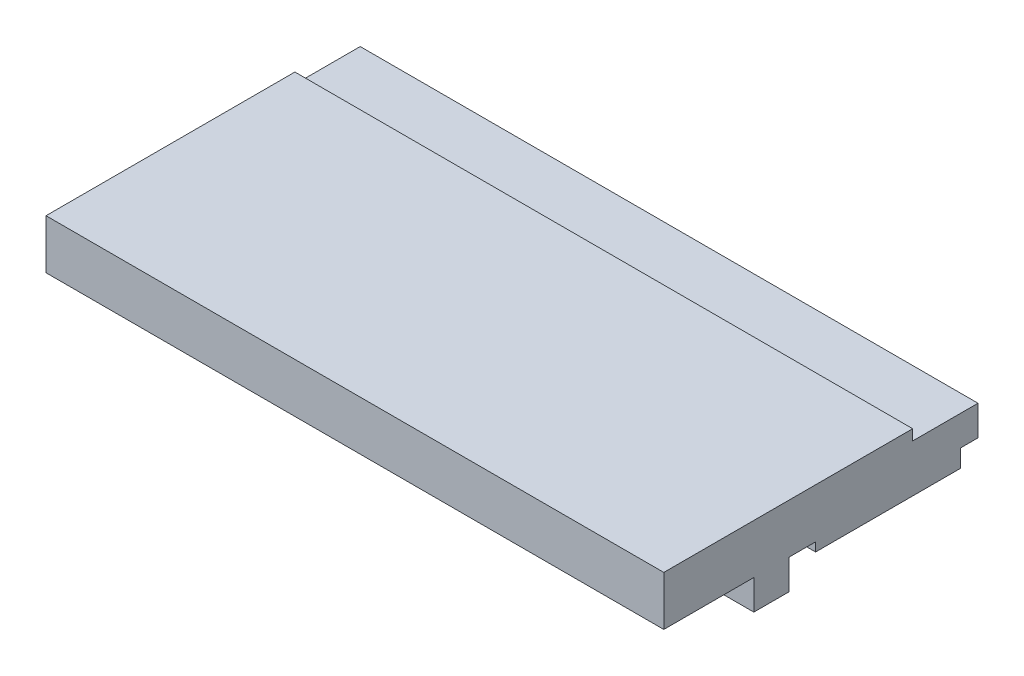
ISO-10303-21;
HEADER;
FILE_DESCRIPTION(('STEP AP214'),'2;1');
FILE_NAME('part.step','',(''),(''),'','','');
FILE_SCHEMA(('AUTOMOTIVE_DESIGN { 1 0 10303 214 1 1 1 1 }'));
ENDSEC;
DATA;
#1=APPLICATION_CONTEXT('core data for automotive mechanical design processes');
#2=APPLICATION_PROTOCOL_DEFINITION('international standard','automotive_design',2000,#1);
#3=PRODUCT_CONTEXT('',#1,'mechanical');
#4=PRODUCT('Part','Part','',(#3));
#5=PRODUCT_RELATED_PRODUCT_CATEGORY('part','',(#4));
#6=PRODUCT_DEFINITION_FORMATION('','',#4);
#7=PRODUCT_DEFINITION_CONTEXT('part definition',#1,'design');
#8=PRODUCT_DEFINITION('design','',#6,#7);
#9=PRODUCT_DEFINITION_SHAPE('','',#8);
#10=(LENGTH_UNIT() NAMED_UNIT(*) SI_UNIT(.MILLI.,.METRE.));
#11=(NAMED_UNIT(*) PLANE_ANGLE_UNIT() SI_UNIT($,.RADIAN.));
#12=(NAMED_UNIT(*) SI_UNIT($,.STERADIAN.) SOLID_ANGLE_UNIT());
#13=UNCERTAINTY_MEASURE_WITH_UNIT(LENGTH_MEASURE(1.E-05),#10,'distance_accuracy_value','');
#14=(GEOMETRIC_REPRESENTATION_CONTEXT(3) GLOBAL_UNCERTAINTY_ASSIGNED_CONTEXT((#13)) GLOBAL_UNIT_ASSIGNED_CONTEXT((#10,
#11,#12)) REPRESENTATION_CONTEXT('',''));
#15=CARTESIAN_POINT('',(0.,0.,0.));
#16=DIRECTION('',(0.,0.,1.));
#17=DIRECTION('',(1.,0.,0.));
#18=AXIS2_PLACEMENT_3D('',#15,#16,#17);
#19=CARTESIAN_POINT('',(350.,0.,0.));
#20=DIRECTION('',(0.,-1.,0.));
#21=DIRECTION('',(0.,0.,-1.));
#22=AXIS2_PLACEMENT_3D('',#19,#20,#21);
#23=PLANE('',#22);
#24=DIRECTION('',(0.,0.,1.));
#25=VECTOR('',#24,1.);
#26=CARTESIAN_POINT('',(0.,0.,0.));
#27=LINE('',#26,#25);
#28=CARTESIAN_POINT('',(0.,0.,0.));
#29=VERTEX_POINT('',#28);
#30=CARTESIAN_POINT('',(0.,0.,37.));
#31=VERTEX_POINT('',#30);
#32=EDGE_CURVE('E171',#29,#31,#27,.T.);
#33=ORIENTED_EDGE('',*,*,#32,.T.);
#34=DIRECTION('',(-1.,0.,0.));
#35=VECTOR('',#34,1.);
#36=CARTESIAN_POINT('',(350.,0.,37.));
#37=LINE('',#36,#35);
#38=CARTESIAN_POINT('',(350.,0.,37.));
#39=VERTEX_POINT('',#38);
#40=EDGE_CURVE('E11',#39,#31,#37,.T.);
#41=ORIENTED_EDGE('',*,*,#40,.F.);
#42=DIRECTION('',(0.,0.,1.));
#43=VECTOR('',#42,1.);
#44=CARTESIAN_POINT('',(350.,0.,0.));
#45=LINE('',#44,#43);
#46=CARTESIAN_POINT('',(350.,0.,0.));
#47=VERTEX_POINT('',#46);
#48=EDGE_CURVE('E197',#47,#39,#45,.T.);
#49=ORIENTED_EDGE('',*,*,#48,.F.);
#50=DIRECTION('',(-1.,0.,0.));
#51=VECTOR('',#50,1.);
#52=CARTESIAN_POINT('',(350.,0.,0.));
#53=LINE('',#52,#51);
#54=EDGE_CURVE('E167',#47,#29,#53,.T.);
#55=ORIENTED_EDGE('',*,*,#54,.T.);
#56=EDGE_LOOP('',(#33,#41,#49,#55));
#57=FACE_BOUND('',#56,.T.);
#58=ADVANCED_FACE('F39',(#57),#23,.F.);
#59=CARTESIAN_POINT('',(350.,0.,37.));
#60=DIRECTION('',(0.,0.,1.));
#61=DIRECTION('',(1.,0.,0.));
#62=AXIS2_PLACEMENT_3D('',#59,#60,#61);
#63=PLANE('',#62);
#64=DIRECTION('',(0.,1.,0.));
#65=VECTOR('',#64,1.);
#66=CARTESIAN_POINT('',(0.,0.,37.));
#67=LINE('',#66,#65);
#68=CARTESIAN_POINT('',(0.,6.,37.));
#69=VERTEX_POINT('',#68);
#70=EDGE_CURVE('E174',#31,#69,#67,.T.);
#71=ORIENTED_EDGE('',*,*,#70,.T.);
#72=DIRECTION('',(-1.,0.,0.));
#73=VECTOR('',#72,1.);
#74=CARTESIAN_POINT('',(350.,6.,37.));
#75=LINE('',#74,#73);
#76=CARTESIAN_POINT('',(350.,6.,37.));
#77=VERTEX_POINT('',#76);
#78=EDGE_CURVE('E47',#77,#69,#75,.T.);
#79=ORIENTED_EDGE('',*,*,#78,.F.);
#80=DIRECTION('',(0.,1.,0.));
#81=VECTOR('',#80,1.);
#82=CARTESIAN_POINT('',(350.,0.,37.));
#83=LINE('',#82,#81);
#84=EDGE_CURVE('E116',#39,#77,#83,.T.);
#85=ORIENTED_EDGE('',*,*,#84,.F.);
#86=ORIENTED_EDGE('',*,*,#40,.T.);
#87=EDGE_LOOP('',(#71,#79,#85,#86));
#88=FACE_BOUND('',#87,.T.);
#89=ADVANCED_FACE('F285',(#88),#63,.F.);
#90=CARTESIAN_POINT('',(350.,6.,37.));
#91=DIRECTION('',(0.,-1.,0.));
#92=DIRECTION('',(0.,0.,-1.));
#93=AXIS2_PLACEMENT_3D('',#90,#91,#92);
#94=PLANE('',#93);
#95=DIRECTION('',(0.,0.,1.));
#96=VECTOR('',#95,1.);
#97=CARTESIAN_POINT('',(0.,6.,37.));
#98=LINE('',#97,#96);
#99=CARTESIAN_POINT('',(0.,5.99999999999998,178.));
#100=VERTEX_POINT('',#99);
#101=EDGE_CURVE('E176',#69,#100,#98,.T.);
#102=ORIENTED_EDGE('',*,*,#101,.T.);
#103=DIRECTION('',(-1.,0.,0.));
#104=VECTOR('',#103,1.);
#105=CARTESIAN_POINT('',(350.,5.99999999999998,178.));
#106=LINE('',#105,#104);
#107=CARTESIAN_POINT('',(350.,5.99999999999998,178.));
#108=VERTEX_POINT('',#107);
#109=EDGE_CURVE('E222',#108,#100,#106,.T.);
#110=ORIENTED_EDGE('',*,*,#109,.F.);
#111=DIRECTION('',(0.,0.,1.));
#112=VECTOR('',#111,1.);
#113=CARTESIAN_POINT('',(350.,6.,37.));
#114=LINE('',#113,#112);
#115=EDGE_CURVE('E230',#77,#108,#114,.T.);
#116=ORIENTED_EDGE('',*,*,#115,.F.);
#117=ORIENTED_EDGE('',*,*,#78,.T.);
#118=EDGE_LOOP('',(#102,#110,#116,#117));
#119=FACE_BOUND('',#118,.T.);
#120=ADVANCED_FACE('F228',(#119),#94,.F.);
#121=CARTESIAN_POINT('',(350.,-22.,178.));
#122=DIRECTION('',(0.,0.,-1.));
#123=DIRECTION('',(-1.,0.,0.));
#124=AXIS2_PLACEMENT_3D('',#121,#122,#123);
#125=PLANE('',#124);
#126=DIRECTION('',(0.,-1.,0.));
#127=VECTOR('',#126,1.);
#128=CARTESIAN_POINT('',(0.,-22.,178.));
#129=LINE('',#128,#127);
#130=CARTESIAN_POINT('',(0.,-22.,178.));
#131=VERTEX_POINT('',#130);
#132=EDGE_CURVE('E178',#100,#131,#129,.T.);
#133=ORIENTED_EDGE('',*,*,#132,.T.);
#134=DIRECTION('',(-1.,0.,0.));
#135=VECTOR('',#134,1.);
#136=CARTESIAN_POINT('',(350.,-22.,178.));
#137=LINE('',#136,#135);
#138=CARTESIAN_POINT('',(350.,-22.,178.));
#139=VERTEX_POINT('',#138);
#140=EDGE_CURVE('E219',#139,#131,#137,.T.);
#141=ORIENTED_EDGE('',*,*,#140,.F.);
#142=DIRECTION('',(0.,-1.,0.));
#143=VECTOR('',#142,1.);
#144=CARTESIAN_POINT('',(350.,-22.,178.));
#145=LINE('',#144,#143);
#146=EDGE_CURVE('E248',#108,#139,#145,.T.);
#147=ORIENTED_EDGE('',*,*,#146,.F.);
#148=ORIENTED_EDGE('',*,*,#109,.T.);
#149=EDGE_LOOP('',(#133,#141,#147,#148));
#150=FACE_BOUND('',#149,.T.);
#151=ADVANCED_FACE('F239',(#150),#125,.F.);
#152=CARTESIAN_POINT('',(350.,-22.,127.));
#153=DIRECTION('',(0.,1.,0.));
#154=DIRECTION('',(0.,0.,1.));
#155=AXIS2_PLACEMENT_3D('',#152,#153,#154);
#156=PLANE('',#155);
#157=DIRECTION('',(0.,0.,-1.));
#158=VECTOR('',#157,1.);
#159=CARTESIAN_POINT('',(0.,-22.,127.));
#160=LINE('',#159,#158);
#161=CARTESIAN_POINT('',(0.,-22.,127.));
#162=VERTEX_POINT('',#161);
#163=EDGE_CURVE('E180',#131,#162,#160,.T.);
#164=ORIENTED_EDGE('',*,*,#163,.T.);
#165=DIRECTION('',(-1.,0.,0.));
#166=VECTOR('',#165,1.);
#167=CARTESIAN_POINT('',(350.,-22.,127.));
#168=LINE('',#167,#166);
#169=CARTESIAN_POINT('',(350.,-22.,127.));
#170=VERTEX_POINT('',#169);
#171=EDGE_CURVE('E216',#170,#162,#168,.T.);
#172=ORIENTED_EDGE('',*,*,#171,.F.);
#173=DIRECTION('',(0.,0.,-1.));
#174=VECTOR('',#173,1.);
#175=CARTESIAN_POINT('',(350.,-22.,127.));
#176=LINE('',#175,#174);
#177=EDGE_CURVE('E245',#139,#170,#176,.T.);
#178=ORIENTED_EDGE('',*,*,#177,.F.);
#179=ORIENTED_EDGE('',*,*,#140,.T.);
#180=EDGE_LOOP('',(#164,#172,#178,#179));
#181=FACE_BOUND('',#180,.T.);
#182=ADVANCED_FACE('F243',(#181),#156,.F.);
#183=CARTESIAN_POINT('',(350.,-39.,127.));
#184=DIRECTION('',(0.,0.,-1.));
#185=DIRECTION('',(-1.,0.,0.));
#186=AXIS2_PLACEMENT_3D('',#183,#184,#185);
#187=PLANE('',#186);
#188=DIRECTION('',(0.,-1.,0.));
#189=VECTOR('',#188,1.);
#190=CARTESIAN_POINT('',(0.,-39.,127.));
#191=LINE('',#190,#189);
#192=CARTESIAN_POINT('',(0.,-39.,127.));
#193=VERTEX_POINT('',#192);
#194=EDGE_CURVE('E182',#162,#193,#191,.T.);
#195=ORIENTED_EDGE('',*,*,#194,.T.);
#196=DIRECTION('',(-1.,0.,0.));
#197=VECTOR('',#196,1.);
#198=CARTESIAN_POINT('',(350.,-39.,127.));
#199=LINE('',#198,#197);
#200=CARTESIAN_POINT('',(350.,-39.,127.));
#201=VERTEX_POINT('',#200);
#202=EDGE_CURVE('E213',#201,#193,#199,.T.);
#203=ORIENTED_EDGE('',*,*,#202,.F.);
#204=DIRECTION('',(0.,-1.,0.));
#205=VECTOR('',#204,1.);
#206=CARTESIAN_POINT('',(350.,-39.,127.));
#207=LINE('',#206,#205);
#208=EDGE_CURVE('E247',#170,#201,#207,.T.);
#209=ORIENTED_EDGE('',*,*,#208,.F.);
#210=ORIENTED_EDGE('',*,*,#171,.T.);
#211=EDGE_LOOP('',(#195,#203,#209,#210));
#212=FACE_BOUND('',#211,.T.);
#213=ADVANCED_FACE('F298',(#212),#187,.F.);
#214=CARTESIAN_POINT('',(350.,-39.,107.));
#215=DIRECTION('',(0.,1.,0.));
#216=DIRECTION('',(0.,0.,1.));
#217=AXIS2_PLACEMENT_3D('',#214,#215,#216);
#218=PLANE('',#217);
#219=DIRECTION('',(0.,0.,-1.));
#220=VECTOR('',#219,1.);
#221=CARTESIAN_POINT('',(0.,-39.,107.));
#222=LINE('',#221,#220);
#223=CARTESIAN_POINT('',(0.,-39.,107.));
#224=VERTEX_POINT('',#223);
#225=EDGE_CURVE('E184',#193,#224,#222,.T.);
#226=ORIENTED_EDGE('',*,*,#225,.T.);
#227=DIRECTION('',(-1.,0.,0.));
#228=VECTOR('',#227,1.);
#229=CARTESIAN_POINT('',(350.,-39.,107.));
#230=LINE('',#229,#228);
#231=CARTESIAN_POINT('',(350.,-39.,107.));
#232=VERTEX_POINT('',#231);
#233=EDGE_CURVE('E210',#232,#224,#230,.T.);
#234=ORIENTED_EDGE('',*,*,#233,.F.);
#235=DIRECTION('',(0.,0.,-1.));
#236=VECTOR('',#235,1.);
#237=CARTESIAN_POINT('',(350.,-39.,107.));
#238=LINE('',#237,#236);
#239=EDGE_CURVE('E250',#201,#232,#238,.T.);
#240=ORIENTED_EDGE('',*,*,#239,.F.);
#241=ORIENTED_EDGE('',*,*,#202,.T.);
#242=EDGE_LOOP('',(#226,#234,#240,#241));
#243=FACE_BOUND('',#242,.T.);
#244=ADVANCED_FACE('F301',(#243),#218,.F.);
#245=CARTESIAN_POINT('',(350.,-22.,107.));
#246=DIRECTION('',(0.,0.,1.));
#247=DIRECTION('',(1.,0.,0.));
#248=AXIS2_PLACEMENT_3D('',#245,#246,#247);
#249=PLANE('',#248);
#250=DIRECTION('',(0.,1.,0.));
#251=VECTOR('',#250,1.);
#252=CARTESIAN_POINT('',(0.,-22.,107.));
#253=LINE('',#252,#251);
#254=CARTESIAN_POINT('',(0.,-22.,107.));
#255=VERTEX_POINT('',#254);
#256=EDGE_CURVE('E186',#224,#255,#253,.T.);
#257=ORIENTED_EDGE('',*,*,#256,.T.);
#258=DIRECTION('',(-1.,0.,0.));
#259=VECTOR('',#258,1.);
#260=CARTESIAN_POINT('',(350.,-22.,107.));
#261=LINE('',#260,#259);
#262=CARTESIAN_POINT('',(350.,-22.,107.));
#263=VERTEX_POINT('',#262);
#264=EDGE_CURVE('E207',#263,#255,#261,.T.);
#265=ORIENTED_EDGE('',*,*,#264,.F.);
#266=DIRECTION('',(0.,1.,0.));
#267=VECTOR('',#266,1.);
#268=CARTESIAN_POINT('',(350.,-22.,107.));
#269=LINE('',#268,#267);
#270=EDGE_CURVE('E256',#232,#263,#269,.T.);
#271=ORIENTED_EDGE('',*,*,#270,.F.);
#272=ORIENTED_EDGE('',*,*,#233,.T.);
#273=EDGE_LOOP('',(#257,#265,#271,#272));
#274=FACE_BOUND('',#273,.T.);
#275=ADVANCED_FACE('F305',(#274),#249,.F.);
#276=CARTESIAN_POINT('',(350.,-22.,92.));
#277=DIRECTION('',(0.,1.,0.));
#278=DIRECTION('',(0.,0.,1.));
#279=AXIS2_PLACEMENT_3D('',#276,#277,#278);
#280=PLANE('',#279);
#281=DIRECTION('',(0.,0.,-1.));
#282=VECTOR('',#281,1.);
#283=CARTESIAN_POINT('',(0.,-22.,92.));
#284=LINE('',#283,#282);
#285=CARTESIAN_POINT('',(0.,-22.,92.));
#286=VERTEX_POINT('',#285);
#287=EDGE_CURVE('E188',#255,#286,#284,.T.);
#288=ORIENTED_EDGE('',*,*,#287,.T.);
#289=DIRECTION('',(-1.,0.,0.));
#290=VECTOR('',#289,1.);
#291=CARTESIAN_POINT('',(350.,-22.,92.));
#292=LINE('',#291,#290);
#293=CARTESIAN_POINT('',(350.,-22.,92.));
#294=VERTEX_POINT('',#293);
#295=EDGE_CURVE('E204',#294,#286,#292,.T.);
#296=ORIENTED_EDGE('',*,*,#295,.F.);
#297=DIRECTION('',(0.,0.,-1.));
#298=VECTOR('',#297,1.);
#299=CARTESIAN_POINT('',(350.,-22.,92.));
#300=LINE('',#299,#298);
#301=EDGE_CURVE('E258',#263,#294,#300,.T.);
#302=ORIENTED_EDGE('',*,*,#301,.F.);
#303=ORIENTED_EDGE('',*,*,#264,.T.);
#304=EDGE_LOOP('',(#288,#296,#302,#303));
#305=FACE_BOUND('',#304,.T.);
#306=ADVANCED_FACE('F309',(#305),#280,.F.);
#307=CARTESIAN_POINT('',(350.,-27.,92.));
#308=DIRECTION('',(0.,0.,-1.));
#309=DIRECTION('',(-1.,0.,0.));
#310=AXIS2_PLACEMENT_3D('',#307,#308,#309);
#311=PLANE('',#310);
#312=DIRECTION('',(0.,-1.,0.));
#313=VECTOR('',#312,1.);
#314=CARTESIAN_POINT('',(0.,-27.,92.));
#315=LINE('',#314,#313);
#316=CARTESIAN_POINT('',(0.,-27.,92.));
#317=VERTEX_POINT('',#316);
#318=EDGE_CURVE('E190',#286,#317,#315,.T.);
#319=ORIENTED_EDGE('',*,*,#318,.T.);
#320=DIRECTION('',(-1.,0.,0.));
#321=VECTOR('',#320,1.);
#322=CARTESIAN_POINT('',(350.,-27.,92.));
#323=LINE('',#322,#321);
#324=CARTESIAN_POINT('',(350.,-27.,92.));
#325=VERTEX_POINT('',#324);
#326=EDGE_CURVE('E201',#325,#317,#323,.T.);
#327=ORIENTED_EDGE('',*,*,#326,.F.);
#328=DIRECTION('',(0.,-1.,0.));
#329=VECTOR('',#328,1.);
#330=CARTESIAN_POINT('',(350.,-27.,92.));
#331=LINE('',#330,#329);
#332=EDGE_CURVE('E260',#294,#325,#331,.T.);
#333=ORIENTED_EDGE('',*,*,#332,.F.);
#334=ORIENTED_EDGE('',*,*,#295,.T.);
#335=EDGE_LOOP('',(#319,#327,#333,#334));
#336=FACE_BOUND('',#335,.T.);
#337=ADVANCED_FACE('F266',(#336),#311,.F.);
#338=CARTESIAN_POINT('',(350.,-27.,10.));
#339=DIRECTION('',(0.,1.,0.));
#340=DIRECTION('',(0.,0.,1.));
#341=AXIS2_PLACEMENT_3D('',#338,#339,#340);
#342=PLANE('',#341);
#343=DIRECTION('',(0.,0.,-1.));
#344=VECTOR('',#343,1.);
#345=CARTESIAN_POINT('',(0.,-27.,10.));
#346=LINE('',#345,#344);
#347=CARTESIAN_POINT('',(0.,-27.,10.));
#348=VERTEX_POINT('',#347);
#349=EDGE_CURVE('E192',#317,#348,#346,.T.);
#350=ORIENTED_EDGE('',*,*,#349,.T.);
#351=DIRECTION('',(-1.,0.,0.));
#352=VECTOR('',#351,1.);
#353=CARTESIAN_POINT('',(350.,-27.,10.));
#354=LINE('',#353,#352);
#355=CARTESIAN_POINT('',(350.,-27.,10.));
#356=VERTEX_POINT('',#355);
#357=EDGE_CURVE('E162',#356,#348,#354,.T.);
#358=ORIENTED_EDGE('',*,*,#357,.F.);
#359=DIRECTION('',(0.,0.,-1.));
#360=VECTOR('',#359,1.);
#361=CARTESIAN_POINT('',(350.,-27.,10.));
#362=LINE('',#361,#360);
#363=EDGE_CURVE('E153',#325,#356,#362,.T.);
#364=ORIENTED_EDGE('',*,*,#363,.F.);
#365=ORIENTED_EDGE('',*,*,#326,.T.);
#366=EDGE_LOOP('',(#350,#358,#364,#365));
#367=FACE_BOUND('',#366,.T.);
#368=ADVANCED_FACE('F270',(#367),#342,.F.);
#369=CARTESIAN_POINT('',(350.,-17.,10.));
#370=DIRECTION('',(0.,0.,1.));
#371=DIRECTION('',(0.,-1.,0.));
#372=AXIS2_PLACEMENT_3D('',#369,#370,#371);
#373=PLANE('',#372);
#374=DIRECTION('',(0.,1.,0.));
#375=VECTOR('',#374,1.);
#376=CARTESIAN_POINT('',(0.,-17.,10.));
#377=LINE('',#376,#375);
#378=CARTESIAN_POINT('',(0.,-17.,10.));
#379=VERTEX_POINT('',#378);
#380=EDGE_CURVE('E161',#348,#379,#377,.T.);
#381=ORIENTED_EDGE('',*,*,#380,.T.);
#382=DIRECTION('',(-1.,0.,0.));
#383=VECTOR('',#382,1.);
#384=CARTESIAN_POINT('',(350.,-17.,10.));
#385=LINE('',#384,#383);
#386=CARTESIAN_POINT('',(350.,-17.,10.));
#387=VERTEX_POINT('',#386);
#388=EDGE_CURVE('E158',#387,#379,#385,.T.);
#389=ORIENTED_EDGE('',*,*,#388,.F.);
#390=DIRECTION('',(0.,1.,0.));
#391=VECTOR('',#390,1.);
#392=CARTESIAN_POINT('',(350.,-17.,10.));
#393=LINE('',#392,#391);
#394=EDGE_CURVE('E147',#356,#387,#393,.T.);
#395=ORIENTED_EDGE('',*,*,#394,.F.);
#396=ORIENTED_EDGE('',*,*,#357,.T.);
#397=EDGE_LOOP('',(#381,#389,#395,#396));
#398=FACE_BOUND('',#397,.T.);
#399=ADVANCED_FACE('F159',(#398),#373,.F.);
#400=CARTESIAN_POINT('',(350.,-17.,0.));
#401=DIRECTION('',(0.,1.,0.));
#402=DIRECTION('',(0.,0.,1.));
#403=AXIS2_PLACEMENT_3D('',#400,#401,#402);
#404=PLANE('',#403);
#405=DIRECTION('',(0.,0.,-1.));
#406=VECTOR('',#405,1.);
#407=CARTESIAN_POINT('',(0.,-17.,0.));
#408=LINE('',#407,#406);
#409=CARTESIAN_POINT('',(0.,-17.,0.));
#410=VERTEX_POINT('',#409);
#411=EDGE_CURVE('E102',#379,#410,#408,.T.);
#412=ORIENTED_EDGE('',*,*,#411,.T.);
#413=DIRECTION('',(-1.,0.,0.));
#414=VECTOR('',#413,1.);
#415=CARTESIAN_POINT('',(350.,-17.,0.));
#416=LINE('',#415,#414);
#417=CARTESIAN_POINT('',(350.,-17.,0.));
#418=VERTEX_POINT('',#417);
#419=EDGE_CURVE('E163',#418,#410,#416,.T.);
#420=ORIENTED_EDGE('',*,*,#419,.F.);
#421=DIRECTION('',(0.,0.,-1.));
#422=VECTOR('',#421,1.);
#423=CARTESIAN_POINT('',(350.,-17.,0.));
#424=LINE('',#423,#422);
#425=EDGE_CURVE('E151',#387,#418,#424,.T.);
#426=ORIENTED_EDGE('',*,*,#425,.F.);
#427=ORIENTED_EDGE('',*,*,#388,.T.);
#428=EDGE_LOOP('',(#412,#420,#426,#427));
#429=FACE_BOUND('',#428,.T.);
#430=ADVANCED_FACE('F165',(#429),#404,.F.);
#431=CARTESIAN_POINT('',(350.,0.,0.));
#432=DIRECTION('',(0.,0.,1.));
#433=DIRECTION('',(0.,-1.,0.));
#434=AXIS2_PLACEMENT_3D('',#431,#432,#433);
#435=PLANE('',#434);
#436=DIRECTION('',(0.,1.,0.));
#437=VECTOR('',#436,1.);
#438=CARTESIAN_POINT('',(0.,0.,0.));
#439=LINE('',#438,#437);
#440=EDGE_CURVE('E108',#410,#29,#439,.T.);
#441=ORIENTED_EDGE('',*,*,#440,.T.);
#442=ORIENTED_EDGE('',*,*,#54,.F.);
#443=DIRECTION('',(0.,1.,0.));
#444=VECTOR('',#443,1.);
#445=CARTESIAN_POINT('',(350.,0.,0.));
#446=LINE('',#445,#444);
#447=EDGE_CURVE('E55',#418,#47,#446,.T.);
#448=ORIENTED_EDGE('',*,*,#447,.F.);
#449=ORIENTED_EDGE('',*,*,#419,.T.);
#450=EDGE_LOOP('',(#441,#442,#448,#449));
#451=FACE_BOUND('',#450,.T.);
#452=ADVANCED_FACE('F274',(#451),#435,.F.);
#453=CARTESIAN_POINT('',(350.,0.,0.));
#454=DIRECTION('',(-1.,0.,0.));
#455=DIRECTION('',(0.,0.,1.));
#456=AXIS2_PLACEMENT_3D('',#453,#454,#455);
#457=PLANE('',#456);
#458=ORIENTED_EDGE('',*,*,#48,.T.);
#459=ORIENTED_EDGE('',*,*,#84,.T.);
#460=ORIENTED_EDGE('',*,*,#115,.T.);
#461=ORIENTED_EDGE('',*,*,#146,.T.);
#462=ORIENTED_EDGE('',*,*,#177,.T.);
#463=ORIENTED_EDGE('',*,*,#208,.T.);
#464=ORIENTED_EDGE('',*,*,#239,.T.);
#465=ORIENTED_EDGE('',*,*,#270,.T.);
#466=ORIENTED_EDGE('',*,*,#301,.T.);
#467=ORIENTED_EDGE('',*,*,#332,.T.);
#468=ORIENTED_EDGE('',*,*,#363,.T.);
#469=ORIENTED_EDGE('',*,*,#394,.T.);
#470=ORIENTED_EDGE('',*,*,#425,.T.);
#471=ORIENTED_EDGE('',*,*,#447,.T.);
#472=EDGE_LOOP('',(#458,#459,#460,#461,#462,#463,#464,#465,#466,#467,#468,#469,#470,#471));
#473=FACE_BOUND('',#472,.T.);
#474=ADVANCED_FACE('F149',(#473),#457,.F.);
#475=CARTESIAN_POINT('',(0.,0.,0.));
#476=DIRECTION('',(-1.,0.,0.));
#477=DIRECTION('',(0.,0.,1.));
#478=AXIS2_PLACEMENT_3D('',#475,#476,#477);
#479=PLANE('',#478);
#480=ORIENTED_EDGE('',*,*,#32,.F.);
#481=ORIENTED_EDGE('',*,*,#440,.F.);
#482=ORIENTED_EDGE('',*,*,#411,.F.);
#483=ORIENTED_EDGE('',*,*,#380,.F.);
#484=ORIENTED_EDGE('',*,*,#349,.F.);
#485=ORIENTED_EDGE('',*,*,#318,.F.);
#486=ORIENTED_EDGE('',*,*,#287,.F.);
#487=ORIENTED_EDGE('',*,*,#256,.F.);
#488=ORIENTED_EDGE('',*,*,#225,.F.);
#489=ORIENTED_EDGE('',*,*,#194,.F.);
#490=ORIENTED_EDGE('',*,*,#163,.F.);
#491=ORIENTED_EDGE('',*,*,#132,.F.);
#492=ORIENTED_EDGE('',*,*,#101,.F.);
#493=ORIENTED_EDGE('',*,*,#70,.F.);
#494=EDGE_LOOP('',(#480,#481,#482,#483,#484,#485,#486,#487,#488,#489,#490,#491,#492,#493));
#495=FACE_BOUND('',#494,.T.);
#496=ADVANCED_FACE('F234',(#495),#479,.T.);
#497=CLOSED_SHELL('',(#58,#89,#120,#151,#182,#213,#244,#275,#306,#337,#368,#399,#430,#452,#474,#496));
#498=MANIFOLD_SOLID_BREP('B2',#497);
#499=ADVANCED_BREP_SHAPE_REPRESENTATION('',(#18,#498),#14);
#500=SHAPE_DEFINITION_REPRESENTATION(#9,#499);
ENDSEC;
END-ISO-10303-21;
